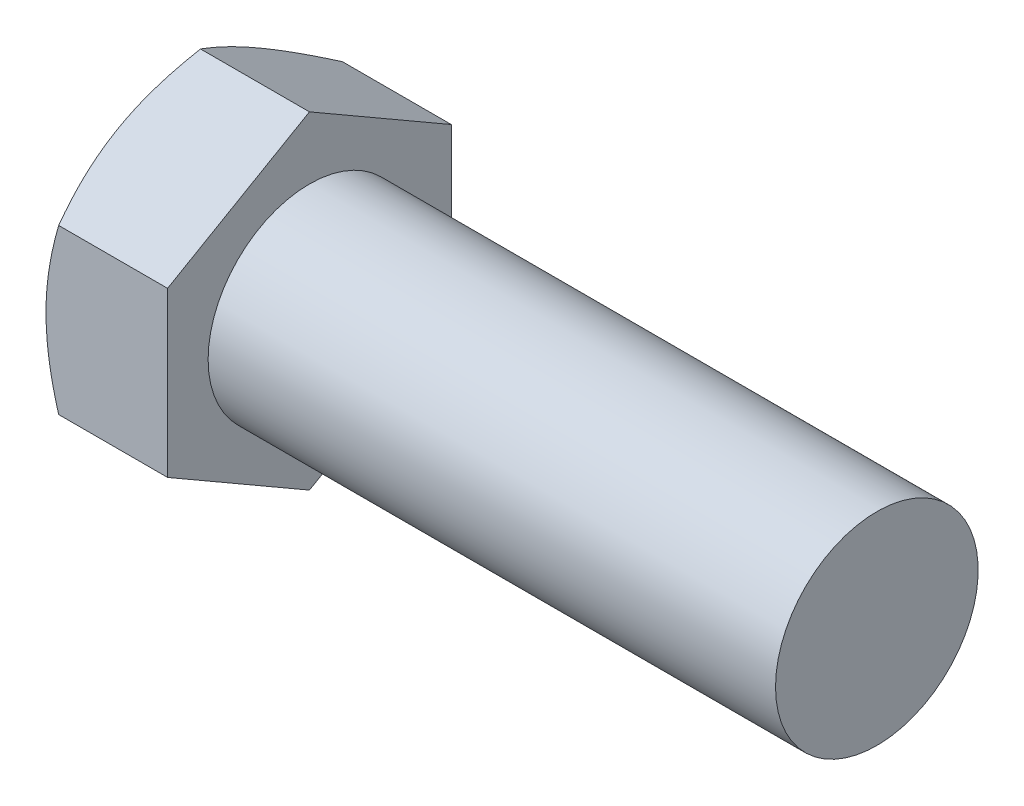
ISO-10303-21;
HEADER;
FILE_DESCRIPTION(('STEP AP214'),'2;1');
FILE_NAME('part.step','',(''),(''),'','','');
FILE_SCHEMA(('AUTOMOTIVE_DESIGN { 1 0 10303 214 1 1 1 1 }'));
ENDSEC;
DATA;
#1=APPLICATION_CONTEXT('core data for automotive mechanical design processes');
#2=APPLICATION_PROTOCOL_DEFINITION('international standard','automotive_design',2000,#1);
#3=PRODUCT_CONTEXT('',#1,'mechanical');
#4=PRODUCT('Part','Part','',(#3));
#5=PRODUCT_RELATED_PRODUCT_CATEGORY('part','',(#4));
#6=PRODUCT_DEFINITION_FORMATION('','',#4);
#7=PRODUCT_DEFINITION_CONTEXT('part definition',#1,'design');
#8=PRODUCT_DEFINITION('design','',#6,#7);
#9=PRODUCT_DEFINITION_SHAPE('','',#8);
#10=(LENGTH_UNIT() NAMED_UNIT(*) SI_UNIT(.MILLI.,.METRE.));
#11=(NAMED_UNIT(*) PLANE_ANGLE_UNIT() SI_UNIT($,.RADIAN.));
#12=(NAMED_UNIT(*) SI_UNIT($,.STERADIAN.) SOLID_ANGLE_UNIT());
#13=UNCERTAINTY_MEASURE_WITH_UNIT(LENGTH_MEASURE(1.E-05),#10,'distance_accuracy_value','');
#14=(GEOMETRIC_REPRESENTATION_CONTEXT(3) GLOBAL_UNCERTAINTY_ASSIGNED_CONTEXT((#13)) GLOBAL_UNIT_ASSIGNED_CONTEXT((#10,
#11,#12)) REPRESENTATION_CONTEXT('',''));
#15=CARTESIAN_POINT('',(0.,0.,0.));
#16=DIRECTION('',(0.,0.,1.));
#17=DIRECTION('',(1.,0.,0.));
#18=AXIS2_PLACEMENT_3D('',#15,#16,#17);
#19=CARTESIAN_POINT('',(6.,4.04145188432738,-7.));
#20=DIRECTION('',(0.,-0.866025403784438,0.5));
#21=DIRECTION('',(0.,-0.5,-0.866025403784439));
#22=AXIS2_PLACEMENT_3D('',#19,#20,#21);
#23=PLANE('',#22);
#24=CARTESIAN_POINT('',(0.625281450434503,8.0830192387086,0.0002));
#25=CARTESIAN_POINT('',(0.573999847053489,7.99418356332252,-0.153667903293392));
#26=CARTESIAN_POINT('',(0.52504559400359,7.90501666556989,-0.308109500554251));
#27=CARTESIAN_POINT('',(0.432432787270138,7.72595873929906,-0.618246926353255));
#28=CARTESIAN_POINT('',(0.388776518079365,7.63606741609896,-0.773943265295416));
#29=CARTESIAN_POINT('',(0.266611592179497,7.36495417725225,-1.24352516958246));
#30=CARTESIAN_POINT('',(0.197125556894954,7.18266208641081,-1.5592643327378));
#31=CARTESIAN_POINT('',(0.115644956399099,6.9098652897096,-2.03176224476633));
#32=CARTESIAN_POINT('',(0.092433484881475,6.82017566928259,-2.18710922425749));
#33=CARTESIAN_POINT('',(0.0535112144324624,6.64039116946081,-2.49850511236216));
#34=CARTESIAN_POINT('',(0.0377997527795302,6.55029632658303,-2.65455395772641));
#35=CARTESIAN_POINT('',(0.014277913283061,6.36995016641051,-2.96692267009517));
#36=CARTESIAN_POINT('',(0.0064585686628658,6.27969914366237,-3.12324202693001));
#37=CARTESIAN_POINT('',(-0.00111975822769145,6.09911871281642,-3.43601650800788));
#38=CARTESIAN_POINT('',(-0.000878989506011251,6.00878930722637,-3.59247162790734));
#39=CARTESIAN_POINT('',(0.0108597318156035,5.76131663355911,-4.02110687218394));
#40=CARTESIAN_POINT('',(0.0305657427429183,5.60425437562033,-4.2931466828854));
#41=CARTESIAN_POINT('',(0.093053460125771,5.29117305327856,-4.8354194400822));
#42=CARTESIAN_POINT('',(0.135856524112987,5.13515508991674,-5.10565047951828));
#43=CARTESIAN_POINT('',(0.242851679710362,4.82144370220969,-5.64901454193983));
#44=CARTESIAN_POINT('',(0.307497094569669,4.6637898619316,-5.92207900330984));
#45=CARTESIAN_POINT('',(0.454216071847038,4.35083323311213,-6.46413578499063));
#46=CARTESIAN_POINT('',(0.536255171025563,4.19552643669178,-6.73313504715144));
#47=CARTESIAN_POINT('',(0.6252814504345,4.04133641427354,-7.0002));
#48=B_SPLINE_CURVE_WITH_KNOTS('',3,(#24,#25,#26,#27,#28,#29,#30,#31,#32,#33,#34,#35,#36,#37,#38,
#39,#40,#41,#42,#43,#44,#45,#46,#47),.UNSPECIFIED.,.F.,.F.,(4,2,2,2,2,2,2,2,2,2,2,4),(0.,
0.554727910214694,1.10969417576209,2.2219327402719,2.76443041023617,3.30688013473358,
3.8487128486711,4.39052882332379,5.33376515141419,6.27787517570456,7.2429241888324,
8.20607866430097),.UNSPECIFIED.);
#49=CARTESIAN_POINT('',(0.625214782339285,8.08290376865476,0.));
#50=VERTEX_POINT('',#49);
#51=CARTESIAN_POINT('',(0.,6.06217782649107,-3.5));
#52=VERTEX_POINT('',#51);
#53=EDGE_CURVE('E54',#50,#52,#48,.T.);
#54=ORIENTED_EDGE('',*,*,#53,.F.);
#55=DIRECTION('',(-1.,0.,0.));
#56=VECTOR('',#55,1.);
#57=CARTESIAN_POINT('',(6.,8.08290376865476,0.));
#58=LINE('',#57,#56);
#59=CARTESIAN_POINT('',(6.,8.08290376865476,0.));
#60=VERTEX_POINT('',#59);
#61=EDGE_CURVE('E150',#60,#50,#58,.T.);
#62=ORIENTED_EDGE('',*,*,#61,.F.);
#63=DIRECTION('',(0.,0.5,0.866025403784439));
#64=VECTOR('',#63,1.);
#65=CARTESIAN_POINT('',(6.,4.04145188432738,-7.));
#66=LINE('',#65,#64);
#67=CARTESIAN_POINT('',(6.,4.04145188432738,-7.));
#68=VERTEX_POINT('',#67);
#69=EDGE_CURVE('E235',#68,#60,#66,.T.);
#70=ORIENTED_EDGE('',*,*,#69,.F.);
#71=DIRECTION('',(-1.,0.,0.));
#72=VECTOR('',#71,1.);
#73=CARTESIAN_POINT('',(6.,4.04145188432738,-7.));
#74=LINE('',#73,#72);
#75=CARTESIAN_POINT('',(0.625214782339283,4.04145188432738,-7.));
#76=VERTEX_POINT('',#75);
#77=EDGE_CURVE('E138',#68,#76,#74,.T.);
#78=ORIENTED_EDGE('',*,*,#77,.T.);
#79=EDGE_CURVE('E132',#52,#76,#48,.T.);
#80=ORIENTED_EDGE('',*,*,#79,.F.);
#81=EDGE_LOOP('',(#54,#62,#70,#78,#80));
#82=FACE_BOUND('',#81,.T.);
#83=ADVANCED_FACE('F38',(#82),#23,.F.);
#84=CARTESIAN_POINT('',(6.,8.08290376865476,0.));
#85=DIRECTION('',(0.,-0.866025403784438,-0.500000000000001));
#86=DIRECTION('',(0.,0.500000000000001,-0.866025403784438));
#87=AXIS2_PLACEMENT_3D('',#84,#85,#86);
#88=PLANE('',#87);
#89=CARTESIAN_POINT('',(0.625281450434498,4.04133641427353,7.0002));
#90=CARTESIAN_POINT('',(0.573999847053485,4.13017208965961,6.84633209670661));
#91=CARTESIAN_POINT('',(0.525045594003586,4.21933898741225,6.69189049944575));
#92=CARTESIAN_POINT('',(0.432432787270134,4.39839691368308,6.38175307364675));
#93=CARTESIAN_POINT('',(0.388776518079361,4.48828823688318,6.22605673470459));
#94=CARTESIAN_POINT('',(0.266611592179494,4.75940147572988,5.75647483041754));
#95=CARTESIAN_POINT('',(0.19712555689495,4.94169356657132,5.4407356672622));
#96=CARTESIAN_POINT('',(0.115644956399095,5.21449036327253,4.96823775523368));
#97=CARTESIAN_POINT('',(0.0924334848814713,5.30417998369955,4.81289077574252));
#98=CARTESIAN_POINT('',(0.0535112144324591,5.48396448352132,4.50149488763784));
#99=CARTESIAN_POINT('',(0.0377997527795272,5.5740593263991,4.3454460422736));
#100=CARTESIAN_POINT('',(0.0142779132830583,5.75440548657162,4.03307732990483));
#101=CARTESIAN_POINT('',(0.0064585686628631,5.84465650931977,3.87675797307));
#102=CARTESIAN_POINT('',(-0.0011197582276945,6.02523694016572,3.56398349199213));
#103=CARTESIAN_POINT('',(-0.000878989506014606,6.11556634575577,3.40752837209267));
#104=CARTESIAN_POINT('',(0.0108597318156001,6.36303901942302,2.97889312781607));
#105=CARTESIAN_POINT('',(0.0305657427429159,6.52010127736181,2.70685331711461));
#106=CARTESIAN_POINT('',(0.0930534601257695,6.83318259970358,2.16458055991781));
#107=CARTESIAN_POINT('',(0.135856524112985,6.9892005630654,1.89434952048172));
#108=CARTESIAN_POINT('',(0.242851679710361,7.30291195077245,1.35098545806017));
#109=CARTESIAN_POINT('',(0.307497094569669,7.46056579105055,1.07792099669016));
#110=CARTESIAN_POINT('',(0.45421607184704,7.77352241987001,0.535864215009373));
#111=CARTESIAN_POINT('',(0.536255171025565,7.92882921629037,0.266864952848561));
#112=CARTESIAN_POINT('',(0.625281450434503,8.0830192387086,-0.000199999999999707));
#113=B_SPLINE_CURVE_WITH_KNOTS('',3,(#89,#90,#91,#92,#93,#94,#95,#96,#97,#98,#99,#100,#101,#102,
#103,#104,#105,#106,#107,#108,#109,#110,#111,#112),.UNSPECIFIED.,.F.,.F.,(4,2,2,2,2,2,2,2,2,2,2,
4),(0.,0.554727910214694,1.10969417576209,2.2219327402719,2.76443041023617,3.30688013473357,
3.8487128486711,4.39052882332379,5.33376515141419,6.27787517570456,7.24292418883241,
8.20607866430098),.UNSPECIFIED.);
#114=CARTESIAN_POINT('',(0.625214782339281,4.04145188432737,7.));
#115=VERTEX_POINT('',#114);
#116=CARTESIAN_POINT('',(0.,6.06217782649107,3.50000000000001));
#117=VERTEX_POINT('',#116);
#118=EDGE_CURVE('E61',#115,#117,#113,.T.);
#119=ORIENTED_EDGE('',*,*,#118,.F.);
#120=DIRECTION('',(-1.,0.,0.));
#121=VECTOR('',#120,1.);
#122=CARTESIAN_POINT('',(6.,4.04145188432737,7.));
#123=LINE('',#122,#121);
#124=CARTESIAN_POINT('',(6.,4.04145188432737,7.));
#125=VERTEX_POINT('',#124);
#126=EDGE_CURVE('E148',#125,#115,#123,.T.);
#127=ORIENTED_EDGE('',*,*,#126,.F.);
#128=DIRECTION('',(0.,-0.500000000000001,0.866025403784438));
#129=VECTOR('',#128,1.);
#130=CARTESIAN_POINT('',(6.,8.08290376865476,0.));
#131=LINE('',#130,#129);
#132=EDGE_CURVE('E233',#60,#125,#131,.T.);
#133=ORIENTED_EDGE('',*,*,#132,.F.);
#134=ORIENTED_EDGE('',*,*,#61,.T.);
#135=EDGE_CURVE('E165',#117,#50,#113,.T.);
#136=ORIENTED_EDGE('',*,*,#135,.F.);
#137=EDGE_LOOP('',(#119,#127,#133,#134,#136));
#138=FACE_BOUND('',#137,.T.);
#139=ADVANCED_FACE('F171',(#138),#88,.F.);
#140=CARTESIAN_POINT('',(6.,4.04145188432737,7.));
#141=DIRECTION('',(0.,0.,-1.));
#142=DIRECTION('',(-1.,0.,0.));
#143=AXIS2_PLACEMENT_3D('',#140,#141,#142);
#144=PLANE('',#143);
#145=CARTESIAN_POINT('',(3.42605329976179,-10.8761620539231,7.));
#146=CARTESIAN_POINT('',(3.27755820349132,-10.5702114233395,7.));
#147=CARTESIAN_POINT('',(3.13048124156945,-10.2635605556065,7.));
#148=CARTESIAN_POINT('',(2.83996091942295,-9.64848593967722,7.));
#149=CARTESIAN_POINT('',(2.69651812826497,-9.34006192299163,7.));
#150=CARTESIAN_POINT('',(2.41334641647184,-8.7194897698864,7.));
#151=CARTESIAN_POINT('',(2.27364178179182,-8.40733051328622,7.));
#152=CARTESIAN_POINT('',(1.99992396974467,-7.78053583811804,7.));
#153=CARTESIAN_POINT('',(1.86591052459145,-7.46590053688228,7.));
#154=CARTESIAN_POINT('',(1.60089266981615,-6.82350970509586,7.));
#155=CARTESIAN_POINT('',(1.47012255155981,-6.49565698259491,7.));
#156=CARTESIAN_POINT('',(1.21843031624008,-5.83612448730116,7.));
#157=CARTESIAN_POINT('',(1.09750930112319,-5.50444429100601,7.));
#158=CARTESIAN_POINT('',(0.868674453715429,-4.83733894531343,7.));
#159=CARTESIAN_POINT('',(0.760734489690108,-4.50192285683054,7.));
#160=CARTESIAN_POINT('',(0.561310089162662,-3.82629185426477,7.));
#161=CARTESIAN_POINT('',(0.469820493385824,-3.48607848096465,7.));
#162=CARTESIAN_POINT('',(0.30815535311806,-2.80244822902186,7.));
#163=CARTESIAN_POINT('',(0.237866304032721,-2.45905893525135,7.));
#164=CARTESIAN_POINT('',(0.151376444577605,-1.94083185685803,7.));
#165=CARTESIAN_POINT('',(0.125702619119261,-1.76755314191995,7.));
#166=CARTESIAN_POINT('',(0.081172722313927,-1.42012831754593,7.));
#167=CARTESIAN_POINT('',(0.0623159606555197,-1.24598229774675,7.));
#168=CARTESIAN_POINT('',(0.0320333673059023,-0.899340454693053,7.));
#169=CARTESIAN_POINT('',(0.0205134671141638,-0.726852881992011,7.));
#170=CARTESIAN_POINT('',(0.00477915474612136,-0.381545115845706,7.));
#171=CARTESIAN_POINT('',(0.000564620673233,-0.208724927998596,7.));
#172=CARTESIAN_POINT('',(-0.000458367482538887,0.13694025209448,7.));
#173=CARTESIAN_POINT('',(0.00273325239541429,0.309785244570919,7.));
#174=CARTESIAN_POINT('',(0.0164444084144389,0.655186501507653,7.));
#175=CARTESIAN_POINT('',(0.0269643070409376,0.827742751262357,7.));
#176=CARTESIAN_POINT('',(0.0607728765365267,1.2417535526591,7.));
#177=CARTESIAN_POINT('',(0.0874998212312238,1.48293330156843,7.));
#178=CARTESIAN_POINT('',(0.153816896583111,1.96350546060583,7.));
#179=CARTESIAN_POINT('',(0.193408753534516,2.20289762645226,7.));
#180=CARTESIAN_POINT('',(0.32938242622205,2.91811104160672,7.));
#181=CARTESIAN_POINT('',(0.4429384217829,3.39071052880466,7.));
#182=CARTESIAN_POINT('',(0.639931268707672,4.0975570741413,7.));
#183=CARTESIAN_POINT('',(0.710984667480469,4.33546587250076,7.));
#184=CARTESIAN_POINT('',(0.860484401906985,4.80897203741965,7.));
#185=CARTESIAN_POINT('',(0.938930790494411,5.04456938741581,7.));
#186=CARTESIAN_POINT('',(1.10195645568307,5.51352861985222,7.));
#187=CARTESIAN_POINT('',(1.1865337689166,5.7468911910926,7.));
#188=CARTESIAN_POINT('',(1.36082457987217,6.21167971269009,7.));
#189=CARTESIAN_POINT('',(1.45053798680922,6.44310569719524,7.));
#190=CARTESIAN_POINT('',(1.68588739067905,7.03387292058498,7.));
#191=CARTESIAN_POINT('',(1.83460816986471,7.39198367628977,7.));
#192=CARTESIAN_POINT('',(2.13999823538411,8.10481130748821,7.));
#193=CARTESIAN_POINT('',(2.29666820507814,8.45952788807201,7.));
#194=CARTESIAN_POINT('',(2.61618881706416,9.16628827989088,7.));
#195=CARTESIAN_POINT('',(2.77904133147944,9.51833124217772,7.));
#196=CARTESIAN_POINT('',(3.10954048758862,10.2201395341046,7.));
#197=CARTESIAN_POINT('',(3.27718698092964,10.569904933815,7.));
#198=CARTESIAN_POINT('',(3.61651874746934,11.2680550462867,7.));
#199=CARTESIAN_POINT('',(3.78820919856893,11.6164372374857,7.));
#200=CARTESIAN_POINT('',(4.13466095178347,12.3116716773237,7.));
#201=CARTESIAN_POINT('',(4.30942227316573,12.6585239163464,7.));
#202=CARTESIAN_POINT('',(4.66141188565852,13.3508961445043,7.));
#203=CARTESIAN_POINT('',(4.83863973728854,13.6964163573141,7.));
#204=CARTESIAN_POINT('',(5.19515425692406,14.3863935714118,7.));
#205=CARTESIAN_POINT('',(5.37444093292636,14.7308505685632,7.));
#206=CARTESIAN_POINT('',(5.88012796768672,15.6965625036949,7.));
#207=CARTESIAN_POINT('',(6.20845847063781,16.3168065882322,7.));
#208=CARTESIAN_POINT('',(6.86920827390349,17.555146903007,7.));
#209=CARTESIAN_POINT('',(7.20162777268215,18.1732430271087,7.));
#210=CARTESIAN_POINT('',(7.86856044469931,19.4059667142938,7.));
#211=CARTESIAN_POINT('',(8.20306464897194,20.0205991346863,7.));
#212=CARTESIAN_POINT('',(8.87444772117495,21.2485130556909,7.));
#213=CARTESIAN_POINT('',(9.21132642957638,21.8617946434917,7.));
#214=CARTESIAN_POINT('',(9.54907573563444,22.474592832059,7.));
#215=B_SPLINE_CURVE_WITH_KNOTS('',3,(#145,#146,#147,#148,#149,#150,#151,#152,#153,#154,#155,
#156,#157,#158,#159,#160,#161,#162,#163,#164,#165,#166,#167,#168,#169,#170,#171,#172,#173,#174,
#175,#176,#177,#178,#179,#180,#181,#182,#183,#184,#185,#186,#187,#188,#189,#190,#191,#192,#193,
#194,#195,#196,#197,#198,#199,#200,#201,#202,#203,#204,#205,#206,#207,#208,#209,#210,#211,#212,
#213,#214),.UNSPECIFIED.,.F.,.F.,(4,2,2,2,2,2,2,2,2,2,2,2,2,2,2,2,2,2,2,2,2,2,2,2,2,2,2,2,2,2,2,
2,2,2,4),(0.,1.0202619600289,2.04068270534537,3.06662307767414,4.09251512308646,
5.15130406009293,6.21021129524842,7.26694987116141,8.32335644535091,9.37400245867031,
9.899400586748,10.4247454969016,10.9432114689492,11.4616687898439,11.9801312882845,
12.4986194337361,13.2261774022874,13.9538330394518,15.4099201654567,16.1547351809612,
16.8995555297364,17.6441384020507,18.3887081172682,19.5518630890561,20.7151182226281,
21.8787284534222,23.0423027144042,24.2074578903336,25.3726203793082,26.5375778547837,
27.7025398566726,29.8078745018868,31.9133117383144,34.0125900956064,36.1117287341302),.UNSPECIFIED.);
#216=CARTESIAN_POINT('',(0.625214782339288,-4.04145188432739,7.));
#217=VERTEX_POINT('',#216);
#218=CARTESIAN_POINT('',(0.,0.,7.));
#219=VERTEX_POINT('',#218);
#220=EDGE_CURVE('E242',#217,#219,#215,.T.);
#221=ORIENTED_EDGE('',*,*,#220,.F.);
#222=DIRECTION('',(-1.,0.,0.));
#223=VECTOR('',#222,1.);
#224=CARTESIAN_POINT('',(6.,-4.04145188432739,7.));
#225=LINE('',#224,#223);
#226=CARTESIAN_POINT('',(6.,-4.04145188432739,7.));
#227=VERTEX_POINT('',#226);
#228=EDGE_CURVE('E140',#227,#217,#225,.T.);
#229=ORIENTED_EDGE('',*,*,#228,.F.);
#230=DIRECTION('',(0.,-1.,0.));
#231=VECTOR('',#230,1.);
#232=CARTESIAN_POINT('',(6.,4.04145188432737,7.));
#233=LINE('',#232,#231);
#234=EDGE_CURVE('E229',#125,#227,#233,.T.);
#235=ORIENTED_EDGE('',*,*,#234,.F.);
#236=ORIENTED_EDGE('',*,*,#126,.T.);
#237=EDGE_CURVE('E187',#219,#115,#215,.T.);
#238=ORIENTED_EDGE('',*,*,#237,.F.);
#239=EDGE_LOOP('',(#221,#229,#235,#236,#238));
#240=FACE_BOUND('',#239,.T.);
#241=ADVANCED_FACE('F248',(#240),#144,.F.);
#242=CARTESIAN_POINT('',(6.,-8.08290376865478,0.));
#243=DIRECTION('',(0.,0.866025403784438,-0.500000000000001));
#244=DIRECTION('',(0.,0.500000000000001,0.866025403784438));
#245=AXIS2_PLACEMENT_3D('',#242,#243,#244);
#246=PLANE('',#245);
#247=CARTESIAN_POINT('',(0.625281450434512,-8.08301923870862,-0.000200000000000537));
#248=CARTESIAN_POINT('',(0.573999847053499,-7.99418356332254,0.153667903293392));
#249=CARTESIAN_POINT('',(0.525045594003599,-7.9050166655699,0.308109500554251));
#250=CARTESIAN_POINT('',(0.432432787270147,-7.72595873929907,0.618246926353256));
#251=CARTESIAN_POINT('',(0.388776518079373,-7.63606741609897,0.773943265295417));
#252=CARTESIAN_POINT('',(0.266611592179506,-7.36495417725227,1.24352516958247));
#253=CARTESIAN_POINT('',(0.197125556894962,-7.18266208641083,1.5592643327378));
#254=CARTESIAN_POINT('',(0.115644956399106,-6.90986528970962,2.03176224476633));
#255=CARTESIAN_POINT('',(0.0924334848814825,-6.8201756692826,2.18710922425749));
#256=CARTESIAN_POINT('',(0.05351121443247,-6.64039116946083,2.49850511236217));
#257=CARTESIAN_POINT('',(0.037799752779538,-6.55029632658305,2.65455395772641));
#258=CARTESIAN_POINT('',(0.0142779132830687,-6.36995016641052,2.96692267009518));
#259=CARTESIAN_POINT('',(0.00645856866287323,-6.27969914366238,3.12324202693001));
#260=CARTESIAN_POINT('',(-0.00111975822768435,-6.09911871281643,3.43601650800788));
#261=CARTESIAN_POINT('',(-0.000878989506004206,-6.00878930722638,3.59247162790734));
#262=CARTESIAN_POINT('',(0.0108597318156104,-5.76131663355912,4.02110687218394));
#263=CARTESIAN_POINT('',(0.0305657427429253,-5.60425437562034,4.2931466828854));
#264=CARTESIAN_POINT('',(0.0930534601257775,-5.29117305327857,4.8354194400822));
#265=CARTESIAN_POINT('',(0.135856524112993,-5.13515508991675,5.10565047951829));
#266=CARTESIAN_POINT('',(0.242851679710368,-4.8214437022097,5.64901454193984));
#267=CARTESIAN_POINT('',(0.307497094569675,-4.66378986193161,5.92207900330984));
#268=CARTESIAN_POINT('',(0.454216071847044,-4.35083323311214,6.46413578499063));
#269=CARTESIAN_POINT('',(0.536255171025569,-4.19552643669179,6.73313504715144));
#270=CARTESIAN_POINT('',(0.625281450434505,-4.04133641427355,7.0002));
#271=B_SPLINE_CURVE_WITH_KNOTS('',3,(#247,#248,#249,#250,#251,#252,#253,#254,#255,#256,#257,
#258,#259,#260,#261,#262,#263,#264,#265,#266,#267,#268,#269,#270),.UNSPECIFIED.,.F.,.F.,(4,2,2,
2,2,2,2,2,2,2,2,4),(0.,0.554727910214696,1.10969417576209,2.22193274027191,2.76443041023618,
3.30688013473358,3.84871284867111,4.3905288233238,5.3337651514142,6.27787517570457,
7.24292418883241,8.20607866430098),.UNSPECIFIED.);
#272=CARTESIAN_POINT('',(0.625214782339296,-8.08290376865478,0.));
#273=VERTEX_POINT('',#272);
#274=CARTESIAN_POINT('',(0.,-6.06217782649107,3.5));
#275=VERTEX_POINT('',#274);
#276=EDGE_CURVE('E173',#273,#275,#271,.T.);
#277=ORIENTED_EDGE('',*,*,#276,.F.);
#278=DIRECTION('',(-1.,0.,0.));
#279=VECTOR('',#278,1.);
#280=CARTESIAN_POINT('',(6.,-8.08290376865478,0.));
#281=LINE('',#280,#279);
#282=CARTESIAN_POINT('',(6.,-8.08290376865478,0.));
#283=VERTEX_POINT('',#282);
#284=EDGE_CURVE('E137',#283,#273,#281,.T.);
#285=ORIENTED_EDGE('',*,*,#284,.F.);
#286=DIRECTION('',(0.,-0.500000000000001,-0.866025403784438));
#287=VECTOR('',#286,1.);
#288=CARTESIAN_POINT('',(6.,-8.08290376865478,0.));
#289=LINE('',#288,#287);
#290=EDGE_CURVE('E227',#227,#283,#289,.T.);
#291=ORIENTED_EDGE('',*,*,#290,.F.);
#292=ORIENTED_EDGE('',*,*,#228,.T.);
#293=EDGE_CURVE('E175',#275,#217,#271,.T.);
#294=ORIENTED_EDGE('',*,*,#293,.F.);
#295=EDGE_LOOP('',(#277,#285,#291,#292,#294));
#296=FACE_BOUND('',#295,.T.);
#297=ADVANCED_FACE('F223',(#296),#246,.F.);
#298=CARTESIAN_POINT('',(6.,-4.04145188432739,-7.));
#299=DIRECTION('',(0.,0.866025403784438,0.500000000000001));
#300=DIRECTION('',(0.,-0.500000000000001,0.866025403784438));
#301=AXIS2_PLACEMENT_3D('',#298,#299,#300);
#302=PLANE('',#301);
#303=CARTESIAN_POINT('',(0.625281450434503,-4.04133641427355,-7.0002));
#304=CARTESIAN_POINT('',(0.573999847053489,-4.13017208965963,-6.84633209670661));
#305=CARTESIAN_POINT('',(0.52504559400359,-4.21933898741227,-6.69189049944575));
#306=CARTESIAN_POINT('',(0.432432787270139,-4.3983969136831,-6.38175307364675));
#307=CARTESIAN_POINT('',(0.388776518079366,-4.4882882368832,-6.22605673470458));
#308=CARTESIAN_POINT('',(0.2666115921795,-4.7594014757299,-5.75647483041754));
#309=CARTESIAN_POINT('',(0.197125556894957,-4.94169356657134,-5.4407356672622));
#310=CARTESIAN_POINT('',(0.115644956399102,-5.21449036327255,-4.96823775523367));
#311=CARTESIAN_POINT('',(0.0924334848814791,-5.30417998369957,-4.81289077574251));
#312=CARTESIAN_POINT('',(0.0535112144324673,-5.48396448352134,-4.50149488763784));
#313=CARTESIAN_POINT('',(0.0377997527795352,-5.57405932639912,-4.34544604227359));
#314=CARTESIAN_POINT('',(0.0142779132830665,-5.75440548657165,-4.03307732990483));
#315=CARTESIAN_POINT('',(0.0064585686628717,-5.84465650931979,-3.87675797306999));
#316=CARTESIAN_POINT('',(-0.00111975822768533,-6.02523694016574,-3.56398349199213));
#317=CARTESIAN_POINT('',(-0.000878989506005298,-6.11556634575579,-3.40752837209267));
#318=CARTESIAN_POINT('',(0.01085973181561,-6.36303901942304,-2.97889312781607));
#319=CARTESIAN_POINT('',(0.0305657427429262,-6.52010127736183,-2.7068533171146));
#320=CARTESIAN_POINT('',(0.0930534601257802,-6.8331825997036,-2.16458055991781));
#321=CARTESIAN_POINT('',(0.135856524112996,-6.98920056306542,-1.89434952048172));
#322=CARTESIAN_POINT('',(0.242851679710372,-7.30291195077247,-1.35098545806017));
#323=CARTESIAN_POINT('',(0.30749709456968,-7.46056579105057,-1.07792099669016));
#324=CARTESIAN_POINT('',(0.454216071847051,-7.77352241987003,-0.535864215009371));
#325=CARTESIAN_POINT('',(0.536255171025576,-7.92882921629039,-0.26686495284856));
#326=CARTESIAN_POINT('',(0.625281450434513,-8.08301923870862,0.000199999999999869));
#327=B_SPLINE_CURVE_WITH_KNOTS('',3,(#303,#304,#305,#306,#307,#308,#309,#310,#311,#312,#313,
#314,#315,#316,#317,#318,#319,#320,#321,#322,#323,#324,#325,#326),.UNSPECIFIED.,.F.,.F.,(4,2,2,
2,2,2,2,2,2,2,2,4),(0.,0.554727910214695,1.10969417576209,2.2219327402719,2.76443041023617,
3.30688013473358,3.8487128486711,4.39052882332379,5.33376515141419,6.27787517570457,
7.24292418883241,8.20607866430098),.UNSPECIFIED.);
#328=CARTESIAN_POINT('',(0.625214782339286,-4.04145188432739,-7.));
#329=VERTEX_POINT('',#328);
#330=CARTESIAN_POINT('',(0.,-6.06217782649107,-3.50000000000001));
#331=VERTEX_POINT('',#330);
#332=EDGE_CURVE('E114',#329,#331,#327,.T.);
#333=ORIENTED_EDGE('',*,*,#332,.F.);
#334=DIRECTION('',(-1.,0.,0.));
#335=VECTOR('',#334,1.);
#336=CARTESIAN_POINT('',(6.,-4.04145188432739,-7.));
#337=LINE('',#336,#335);
#338=CARTESIAN_POINT('',(6.,-4.04145188432739,-7.));
#339=VERTEX_POINT('',#338);
#340=EDGE_CURVE('E128',#339,#329,#337,.T.);
#341=ORIENTED_EDGE('',*,*,#340,.F.);
#342=DIRECTION('',(0.,0.500000000000001,-0.866025403784438));
#343=VECTOR('',#342,1.);
#344=CARTESIAN_POINT('',(6.,-4.04145188432739,-7.));
#345=LINE('',#344,#343);
#346=EDGE_CURVE('E225',#283,#339,#345,.T.);
#347=ORIENTED_EDGE('',*,*,#346,.F.);
#348=ORIENTED_EDGE('',*,*,#284,.T.);
#349=EDGE_CURVE('E131',#331,#273,#327,.T.);
#350=ORIENTED_EDGE('',*,*,#349,.F.);
#351=EDGE_LOOP('',(#333,#341,#347,#348,#350));
#352=FACE_BOUND('',#351,.T.);
#353=ADVANCED_FACE('F126',(#352),#302,.F.);
#354=CARTESIAN_POINT('',(6.,4.04145188432738,-7.));
#355=DIRECTION('',(0.,0.,1.));
#356=DIRECTION('',(0.,-1.,0.));
#357=AXIS2_PLACEMENT_3D('',#354,#355,#356);
#358=PLANE('',#357);
#359=CARTESIAN_POINT('',(3.42605329995402,-10.876162054319,-7.));
#360=CARTESIAN_POINT('',(3.2775582036755,-10.5702114237221,-7.));
#361=CARTESIAN_POINT('',(3.13048124174559,-10.2635605559758,-7.));
#362=CARTESIAN_POINT('',(2.83996091958305,-9.64848594001984,-7.));
#363=CARTESIAN_POINT('',(2.69651812841707,-9.34006192332089,-7.));
#364=CARTESIAN_POINT('',(2.41334641660793,-8.71948977018872,-7.));
#365=CARTESIAN_POINT('',(2.27364178191991,-8.40733051357497,-7.));
#366=CARTESIAN_POINT('',(1.99992396985687,-7.78053583837954,-7.));
#367=CARTESIAN_POINT('',(1.86591052469578,-7.46590053713012,-7.));
#368=CARTESIAN_POINT('',(1.60089266990455,-6.82350970531535,-7.));
#369=CARTESIAN_POINT('',(1.47012255164015,-6.49565698279973,-7.));
#370=CARTESIAN_POINT('',(1.21843031630476,-5.83612448747638,-7.));
#371=CARTESIAN_POINT('',(1.09750930118025,-5.50444429116631,-7.));
#372=CARTESIAN_POINT('',(0.868674453758007,-4.83733894544361,-7.));
#373=CARTESIAN_POINT('',(0.760734489725808,-4.50192285694552,-7.));
#374=CARTESIAN_POINT('',(0.561310089185746,-3.82629185434894,-7.));
#375=CARTESIAN_POINT('',(0.469820493403167,-3.48607848103321,-7.));
#376=CARTESIAN_POINT('',(0.308155353123843,-2.80244822905106,-7.));
#377=CARTESIAN_POINT('',(0.237866304033141,-2.45905893525668,-7.));
#378=CARTESIAN_POINT('',(0.151376444572686,-1.94083185682716,-7.));
#379=CARTESIAN_POINT('',(0.125702619113014,-1.76755314187695,-7.));
#380=CARTESIAN_POINT('',(0.0811727223060239,-1.42012831747856,-7.));
#381=CARTESIAN_POINT('',(0.0623159606472883,-1.24598229766715,-7.));
#382=CARTESIAN_POINT('',(0.0320333672980921,-0.899340454589244,-7.));
#383=CARTESIAN_POINT('',(0.0205134671070838,-0.726852881876223,-7.));
#384=CARTESIAN_POINT('',(0.0047791547415555,-0.381545115705987,-7.));
#385=CARTESIAN_POINT('',(0.000564620670450977,-0.208724927846926,-7.));
#386=CARTESIAN_POINT('',(-0.000458367480728405,0.136940252269961,-7.));
#387=CARTESIAN_POINT('',(0.00273325240003368,0.309785244758258,-7.));
#388=CARTESIAN_POINT('',(0.0164444084256261,0.655186501718555,-7.));
#389=CARTESIAN_POINT('',(0.0269643070558838,0.827742751484962,-7.));
#390=CARTESIAN_POINT('',(0.0607728765607224,1.24175355289996,-7.));
#391=CARTESIAN_POINT('',(0.0874998212607574,1.4829333018158,-7.));
#392=CARTESIAN_POINT('',(0.15381689662361,1.96350546086593,-7.));
#393=CARTESIAN_POINT('',(0.193408753580641,2.20289762671857,-7.));
#394=CARTESIAN_POINT('',(0.329382426285176,2.91811104189136,-7.));
#395=CARTESIAN_POINT('',(0.442938421857516,3.39071052910105,-7.));
#396=CARTESIAN_POINT('',(0.639931268799256,4.09755707445527,-7.));
#397=CARTESIAN_POINT('',(0.710984667577749,4.33546587282071,-7.));
#398=CARTESIAN_POINT('',(0.860484402015489,4.80897203775149,-7.));
#399=CARTESIAN_POINT('',(0.938930790608442,5.04456938775357,-7.));
#400=CARTESIAN_POINT('',(1.10195645580796,5.51352862020177,-7.));
#401=CARTESIAN_POINT('',(1.18653376904683,5.74689119144803,-7.));
#402=CARTESIAN_POINT('',(1.36082458001289,6.21167971305727,-7.));
#403=CARTESIAN_POINT('',(1.45053798695511,6.44310569756829,-7.));
#404=CARTESIAN_POINT('',(1.68588739083341,7.03387292096172,-7.));
#405=CARTESIAN_POINT('',(1.83460817002193,7.39198367666445,-7.));
#406=CARTESIAN_POINT('',(2.13999823554628,8.10481130785904,-7.));
#407=CARTESIAN_POINT('',(2.2966682052424,8.45952788844105,-7.));
#408=CARTESIAN_POINT('',(2.61618881723204,9.16628828025651,-7.));
#409=CARTESIAN_POINT('',(2.77904133164883,9.51833124254174,-7.));
#410=CARTESIAN_POINT('',(3.10954048776064,10.2201395344656,-7.));
#411=CARTESIAN_POINT('',(3.27718698110277,10.5699049341745,-7.));
#412=CARTESIAN_POINT('',(3.61651874764434,11.2680550466434,-7.));
#413=CARTESIAN_POINT('',(3.78820919874469,11.616437237841,-7.));
#414=CARTESIAN_POINT('',(4.13466095196052,12.3116716776764,-7.));
#415=CARTESIAN_POINT('',(4.3094222733433,12.6585239166978,-7.));
#416=CARTESIAN_POINT('',(4.66141188583697,13.3508961448532,-7.));
#417=CARTESIAN_POINT('',(4.83863973746734,13.6964163576619,-7.));
#418=CARTESIAN_POINT('',(5.19515425710343,14.3863935717572,-7.));
#419=CARTESIAN_POINT('',(5.37444093310594,14.7308505689075,-7.));
#420=CARTESIAN_POINT('',(5.8801279678677,15.696562504038,-7.));
#421=CARTESIAN_POINT('',(6.20845847081986,16.3168065885752,-7.));
#422=CARTESIAN_POINT('',(6.86920827408747,17.55514690335,-7.));
#423=CARTESIAN_POINT('',(7.20162777286699,18.1732430274517,-7.));
#424=CARTESIAN_POINT('',(7.86856044488588,19.4059667146373,-7.));
#425=CARTESIAN_POINT('',(8.20306464915937,20.0205991350301,-7.));
#426=CARTESIAN_POINT('',(8.87444772136401,21.2485130560356,-7.));
#427=CARTESIAN_POINT('',(9.21132642976621,21.8617946438369,-7.));
#428=CARTESIAN_POINT('',(9.54907573582499,22.4745928324047,-6.99999999999999));
#429=B_SPLINE_CURVE_WITH_KNOTS('',3,(#359,#360,#361,#362,#363,#364,#365,#366,#367,#368,#369,
#370,#371,#372,#373,#374,#375,#376,#377,#378,#379,#380,#381,#382,#383,#384,#385,#386,#387,#388,
#389,#390,#391,#392,#393,#394,#395,#396,#397,#398,#399,#400,#401,#402,#403,#404,#405,#406,#407,
#408,#409,#410,#411,#412,#413,#414,#415,#416,#417,#418,#419,#420,#421,#422,#423,#424,#425,#426,
#427,#428),.UNSPECIFIED.,.F.,.F.,(4,2,2,2,2,2,2,2,2,2,2,2,2,2,2,2,2,2,2,2,2,2,2,2,2,2,2,2,2,2,2,
2,2,2,4),(0.,1.02026196007537,2.04068270543831,3.06662307781407,4.09251512327337,
5.15130406032968,6.21021129553503,7.26694987149772,8.32335644573687,9.37400245912944,
9.8994005872437,10.4247454974339,10.9432114695172,11.4616687904475,11.9801312889238,
12.4986194344111,13.2261774029835,13.9538330401691,15.4099201662164,16.154735181743,
16.8995555305402,17.6441384028766,18.3887081181161,19.5518630899017,20.7151182234713,
21.8787284542629,23.0423027152425,24.2074578911692,25.3726203801411,26.5375778556139,
27.7025398575001,29.8078745027157,31.9133117391445,34.0125900964389,36.111728734965),.UNSPECIFIED.);
#430=CARTESIAN_POINT('',(0.,0.,-7.));
#431=VERTEX_POINT('',#430);
#432=EDGE_CURVE('E120',#76,#431,#429,.F.);
#433=ORIENTED_EDGE('',*,*,#432,.F.);
#434=ORIENTED_EDGE('',*,*,#77,.F.);
#435=DIRECTION('',(0.,1.,0.));
#436=VECTOR('',#435,1.);
#437=CARTESIAN_POINT('',(6.,4.04145188432738,-7.));
#438=LINE('',#437,#436);
#439=EDGE_CURVE('E136',#339,#68,#438,.T.);
#440=ORIENTED_EDGE('',*,*,#439,.F.);
#441=ORIENTED_EDGE('',*,*,#340,.T.);
#442=EDGE_CURVE('E111',#431,#329,#429,.F.);
#443=ORIENTED_EDGE('',*,*,#442,.F.);
#444=EDGE_LOOP('',(#433,#434,#440,#441,#443));
#445=FACE_BOUND('',#444,.T.);
#446=ADVANCED_FACE('F134',(#445),#358,.F.);
#447=CARTESIAN_POINT('',(6.,0.,-14.));
#448=DIRECTION('',(1.,0.,0.));
#449=DIRECTION('',(0.,0.,-1.));
#450=AXIS2_PLACEMENT_3D('',#447,#448,#449);
#451=PLANE('',#450);
#452=CARTESIAN_POINT('',(6.,0.,0.));
#453=DIRECTION('',(1.,0.,0.));
#454=DIRECTION('',(0.,0.,-1.));
#455=AXIS2_PLACEMENT_3D('',#452,#453,#454);
#456=CIRCLE('',#455,5.);
#457=CARTESIAN_POINT('',(6.,0.,-5.));
#458=VERTEX_POINT('',#457);
#459=EDGE_CURVE('E238',#458,#458,#456,.F.);
#460=ORIENTED_EDGE('',*,*,#459,.T.);
#461=EDGE_LOOP('',(#460));
#462=FACE_BOUND('',#461,.T.);
#463=ORIENTED_EDGE('',*,*,#69,.T.);
#464=ORIENTED_EDGE('',*,*,#132,.T.);
#465=ORIENTED_EDGE('',*,*,#234,.T.);
#466=ORIENTED_EDGE('',*,*,#290,.T.);
#467=ORIENTED_EDGE('',*,*,#346,.T.);
#468=ORIENTED_EDGE('',*,*,#439,.T.);
#469=EDGE_LOOP('',(#463,#464,#465,#466,#467,#468));
#470=FACE_BOUND('',#469,.T.);
#471=ADVANCED_FACE('F250',(#462,#470),#451,.T.);
#472=CARTESIAN_POINT('',(0.,0.,0.));
#473=DIRECTION('',(-1.,0.,0.));
#474=DIRECTION('',(0.,0.,1.));
#475=AXIS2_PLACEMENT_3D('',#472,#473,#474);
#476=CYLINDRICAL_SURFACE('',#475,5.);
#477=ORIENTED_EDGE('',*,*,#459,.F.);
#478=EDGE_LOOP('',(#477));
#479=FACE_BOUND('',#478,.T.);
#480=CARTESIAN_POINT('',(34.,0.,0.));
#481=DIRECTION('',(-1.,0.,0.));
#482=DIRECTION('',(0.,0.,1.));
#483=AXIS2_PLACEMENT_3D('',#480,#481,#482);
#484=CIRCLE('',#483,5.);
#485=CARTESIAN_POINT('',(34.,0.,5.));
#486=VERTEX_POINT('',#485);
#487=EDGE_CURVE('E240',#486,#486,#484,.T.);
#488=ORIENTED_EDGE('',*,*,#487,.T.);
#489=EDGE_LOOP('',(#488));
#490=FACE_BOUND('',#489,.T.);
#491=ADVANCED_FACE('F280',(#479,#490),#476,.T.);
#492=CARTESIAN_POINT('',(34.,0.,0.));
#493=DIRECTION('',(-1.,0.,0.));
#494=DIRECTION('',(0.,0.,1.));
#495=AXIS2_PLACEMENT_3D('',#492,#493,#494);
#496=PLANE('',#495);
#497=ORIENTED_EDGE('',*,*,#487,.F.);
#498=EDGE_LOOP('',(#497));
#499=FACE_BOUND('',#498,.T.);
#500=ADVANCED_FACE('F200',(#499),#496,.F.);
#501=CARTESIAN_POINT('',(0.,0.,0.));
#502=DIRECTION('',(1.,0.,0.));
#503=DIRECTION('',(0.,0.,-1.));
#504=AXIS2_PLACEMENT_3D('',#501,#502,#503);
#505=CONICAL_SURFACE('',#504,7.,1.0471975511966);
#506=ORIENTED_EDGE('',*,*,#332,.T.);
#507=CARTESIAN_POINT('',(0.,0.,0.));
#508=DIRECTION('',(1.,0.,0.));
#509=DIRECTION('',(0.,0.,-1.));
#510=AXIS2_PLACEMENT_3D('',#507,#508,#509);
#511=CIRCLE('',#510,7.);
#512=EDGE_CURVE('E42',#331,#431,#511,.T.);
#513=ORIENTED_EDGE('',*,*,#512,.T.);
#514=ORIENTED_EDGE('',*,*,#442,.T.);
#515=EDGE_LOOP('',(#506,#513,#514));
#516=FACE_BOUND('',#515,.T.);
#517=ADVANCED_FACE('F113',(#516),#505,.T.);
#518=ORIENTED_EDGE('',*,*,#276,.T.);
#519=EDGE_CURVE('E155',#275,#331,#511,.T.);
#520=ORIENTED_EDGE('',*,*,#519,.T.);
#521=ORIENTED_EDGE('',*,*,#349,.T.);
#522=EDGE_LOOP('',(#518,#520,#521));
#523=FACE_BOUND('',#522,.T.);
#524=ADVANCED_FACE('F199',(#523),#505,.T.);
#525=ORIENTED_EDGE('',*,*,#220,.T.);
#526=EDGE_CURVE('E156',#219,#275,#511,.T.);
#527=ORIENTED_EDGE('',*,*,#526,.T.);
#528=ORIENTED_EDGE('',*,*,#293,.T.);
#529=EDGE_LOOP('',(#525,#527,#528));
#530=FACE_BOUND('',#529,.T.);
#531=ADVANCED_FACE('F194',(#530),#505,.T.);
#532=ORIENTED_EDGE('',*,*,#237,.T.);
#533=ORIENTED_EDGE('',*,*,#118,.T.);
#534=CARTESIAN_POINT('',(0.,0.,0.));
#535=DIRECTION('',(-1.,0.,0.));
#536=DIRECTION('',(0.,0.,1.));
#537=AXIS2_PLACEMENT_3D('',#534,#535,#536);
#538=CIRCLE('',#537,7.);
#539=EDGE_CURVE('E121',#219,#117,#538,.T.);
#540=ORIENTED_EDGE('',*,*,#539,.F.);
#541=EDGE_LOOP('',(#532,#533,#540));
#542=FACE_BOUND('',#541,.T.);
#543=ADVANCED_FACE('F198',(#542),#505,.T.);
#544=ORIENTED_EDGE('',*,*,#135,.T.);
#545=ORIENTED_EDGE('',*,*,#53,.T.);
#546=EDGE_CURVE('E47',#52,#117,#511,.T.);
#547=ORIENTED_EDGE('',*,*,#546,.T.);
#548=EDGE_LOOP('',(#544,#545,#547));
#549=FACE_BOUND('',#548,.T.);
#550=ADVANCED_FACE('F164',(#549),#505,.T.);
#551=ORIENTED_EDGE('',*,*,#79,.T.);
#552=ORIENTED_EDGE('',*,*,#432,.T.);
#553=EDGE_CURVE('E11',#431,#52,#511,.T.);
#554=ORIENTED_EDGE('',*,*,#553,.T.);
#555=EDGE_LOOP('',(#551,#552,#554));
#556=FACE_BOUND('',#555,.T.);
#557=ADVANCED_FACE('F253',(#556),#505,.T.);
#558=CARTESIAN_POINT('',(0.,0.,-14.));
#559=DIRECTION('',(1.,0.,0.));
#560=DIRECTION('',(0.,0.,-1.));
#561=AXIS2_PLACEMENT_3D('',#558,#559,#560);
#562=PLANE('',#561);
#563=ORIENTED_EDGE('',*,*,#553,.F.);
#564=ORIENTED_EDGE('',*,*,#512,.F.);
#565=ORIENTED_EDGE('',*,*,#519,.F.);
#566=ORIENTED_EDGE('',*,*,#526,.F.);
#567=ORIENTED_EDGE('',*,*,#539,.T.);
#568=ORIENTED_EDGE('',*,*,#546,.F.);
#569=EDGE_LOOP('',(#563,#564,#565,#566,#567,#568));
#570=FACE_BOUND('',#569,.T.);
#571=ADVANCED_FACE('F168',(#570),#562,.F.);
#572=CLOSED_SHELL('',(#83,#139,#241,#297,#353,#446,#471,#491,#500,#517,#524,#531,#543,#550,#557,#571));
#573=MANIFOLD_SOLID_BREP('B2',#572);
#574=ADVANCED_BREP_SHAPE_REPRESENTATION('',(#18,#573),#14);
#575=SHAPE_DEFINITION_REPRESENTATION(#9,#574);
ENDSEC;
END-ISO-10303-21;
